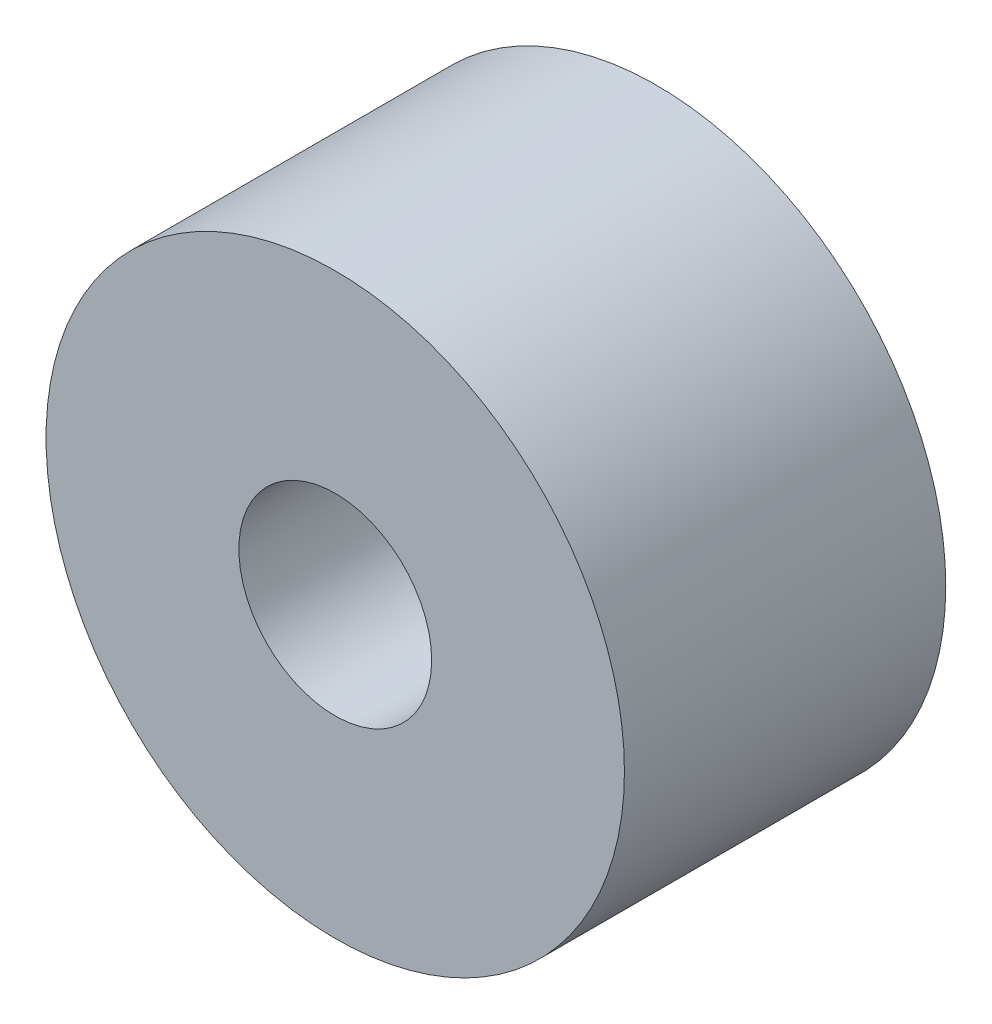
ISO-10303-21;
HEADER;
FILE_DESCRIPTION(('STEP AP214'),'2;1');
FILE_NAME('part.step','',(''),(''),'','','');
FILE_SCHEMA(('AUTOMOTIVE_DESIGN { 1 0 10303 214 1 1 1 1 }'));
ENDSEC;
DATA;
#1=APPLICATION_CONTEXT('core data for automotive mechanical design processes');
#2=APPLICATION_PROTOCOL_DEFINITION('international standard','automotive_design',2000,#1);
#3=PRODUCT_CONTEXT('',#1,'mechanical');
#4=PRODUCT('Part','Part','',(#3));
#5=PRODUCT_RELATED_PRODUCT_CATEGORY('part','',(#4));
#6=PRODUCT_DEFINITION_FORMATION('','',#4);
#7=PRODUCT_DEFINITION_CONTEXT('part definition',#1,'design');
#8=PRODUCT_DEFINITION('design','',#6,#7);
#9=PRODUCT_DEFINITION_SHAPE('','',#8);
#10=(LENGTH_UNIT() NAMED_UNIT(*) SI_UNIT(.MILLI.,.METRE.));
#11=(NAMED_UNIT(*) PLANE_ANGLE_UNIT() SI_UNIT($,.RADIAN.));
#12=(NAMED_UNIT(*) SI_UNIT($,.STERADIAN.) SOLID_ANGLE_UNIT());
#13=UNCERTAINTY_MEASURE_WITH_UNIT(LENGTH_MEASURE(1.E-05),#10,'distance_accuracy_value','');
#14=(GEOMETRIC_REPRESENTATION_CONTEXT(3) GLOBAL_UNCERTAINTY_ASSIGNED_CONTEXT((#13)) GLOBAL_UNIT_ASSIGNED_CONTEXT((#10,
#11,#12)) REPRESENTATION_CONTEXT('',''));
#15=CARTESIAN_POINT('',(0.,0.,0.));
#16=DIRECTION('',(0.,0.,1.));
#17=DIRECTION('',(1.,0.,0.));
#18=AXIS2_PLACEMENT_3D('',#15,#16,#17);
#19=CARTESIAN_POINT('',(0.,0.,2.5));
#20=DIRECTION('',(0.,0.,1.));
#21=DIRECTION('',(1.,0.,0.));
#22=AXIS2_PLACEMENT_3D('',#19,#20,#21);
#23=PLANE('',#22);
#24=CARTESIAN_POINT('',(0.,0.,2.5));
#25=DIRECTION('',(0.,0.,1.));
#26=DIRECTION('',(1.,0.,0.));
#27=AXIS2_PLACEMENT_3D('',#24,#25,#26);
#28=CIRCLE('',#27,2.25);
#29=CARTESIAN_POINT('',(2.25,0.,2.5));
#30=VERTEX_POINT('',#29);
#31=EDGE_CURVE('E10',#30,#30,#28,.T.);
#32=ORIENTED_EDGE('',*,*,#31,.T.);
#33=EDGE_LOOP('',(#32));
#34=FACE_BOUND('',#33,.T.);
#35=CARTESIAN_POINT('',(0.,0.,2.5));
#36=DIRECTION('',(0.,0.,1.));
#37=DIRECTION('',(1.,0.,0.));
#38=AXIS2_PLACEMENT_3D('',#35,#36,#37);
#39=CIRCLE('',#38,0.75);
#40=CARTESIAN_POINT('',(0.75,0.,2.5));
#41=VERTEX_POINT('',#40);
#42=EDGE_CURVE('E42',#41,#41,#39,.T.);
#43=ORIENTED_EDGE('',*,*,#42,.F.);
#44=EDGE_LOOP('',(#43));
#45=FACE_BOUND('',#44,.T.);
#46=ADVANCED_FACE('F31',(#34,#45),#23,.T.);
#47=CARTESIAN_POINT('',(0.,0.,0.));
#48=DIRECTION('',(0.,0.,1.));
#49=DIRECTION('',(1.,0.,0.));
#50=AXIS2_PLACEMENT_3D('',#47,#48,#49);
#51=PLANE('',#50);
#52=CARTESIAN_POINT('',(0.,0.,0.));
#53=DIRECTION('',(0.,0.,1.));
#54=DIRECTION('',(1.,0.,0.));
#55=AXIS2_PLACEMENT_3D('',#52,#53,#54);
#56=CIRCLE('',#55,2.25);
#57=CARTESIAN_POINT('',(2.25,0.,0.));
#58=VERTEX_POINT('',#57);
#59=EDGE_CURVE('E35',#58,#58,#56,.T.);
#60=ORIENTED_EDGE('',*,*,#59,.F.);
#61=EDGE_LOOP('',(#60));
#62=FACE_BOUND('',#61,.T.);
#63=CARTESIAN_POINT('',(0.,0.,0.));
#64=DIRECTION('',(0.,0.,1.));
#65=DIRECTION('',(1.,0.,0.));
#66=AXIS2_PLACEMENT_3D('',#63,#64,#65);
#67=CIRCLE('',#66,0.75);
#68=CARTESIAN_POINT('',(0.75,0.,0.));
#69=VERTEX_POINT('',#68);
#70=EDGE_CURVE('E44',#69,#69,#67,.T.);
#71=ORIENTED_EDGE('',*,*,#70,.T.);
#72=EDGE_LOOP('',(#71));
#73=FACE_BOUND('',#72,.T.);
#74=ADVANCED_FACE('F54',(#62,#73),#51,.F.);
#75=CARTESIAN_POINT('',(0.,0.,2.5));
#76=DIRECTION('',(0.,0.,-1.));
#77=DIRECTION('',(-1.,0.,0.));
#78=AXIS2_PLACEMENT_3D('',#75,#76,#77);
#79=CYLINDRICAL_SURFACE('',#78,2.25);
#80=ORIENTED_EDGE('',*,*,#31,.F.);
#81=EDGE_LOOP('',(#80));
#82=FACE_BOUND('',#81,.T.);
#83=ORIENTED_EDGE('',*,*,#59,.T.);
#84=EDGE_LOOP('',(#83));
#85=FACE_BOUND('',#84,.T.);
#86=ADVANCED_FACE('F33',(#82,#85),#79,.T.);
#87=CARTESIAN_POINT('',(0.,0.,2.5));
#88=DIRECTION('',(0.,0.,-1.));
#89=DIRECTION('',(-1.,0.,0.));
#90=AXIS2_PLACEMENT_3D('',#87,#88,#89);
#91=CYLINDRICAL_SURFACE('',#90,0.75);
#92=ORIENTED_EDGE('',*,*,#42,.T.);
#93=EDGE_LOOP('',(#92));
#94=FACE_BOUND('',#93,.T.);
#95=ORIENTED_EDGE('',*,*,#70,.F.);
#96=EDGE_LOOP('',(#95));
#97=FACE_BOUND('',#96,.T.);
#98=ADVANCED_FACE('F50',(#94,#97),#91,.F.);
#99=CLOSED_SHELL('',(#46,#74,#86,#98));
#100=MANIFOLD_SOLID_BREP('B2',#99);
#101=ADVANCED_BREP_SHAPE_REPRESENTATION('',(#18,#100),#14);
#102=SHAPE_DEFINITION_REPRESENTATION(#9,#101);
ENDSEC;
END-ISO-10303-21;
